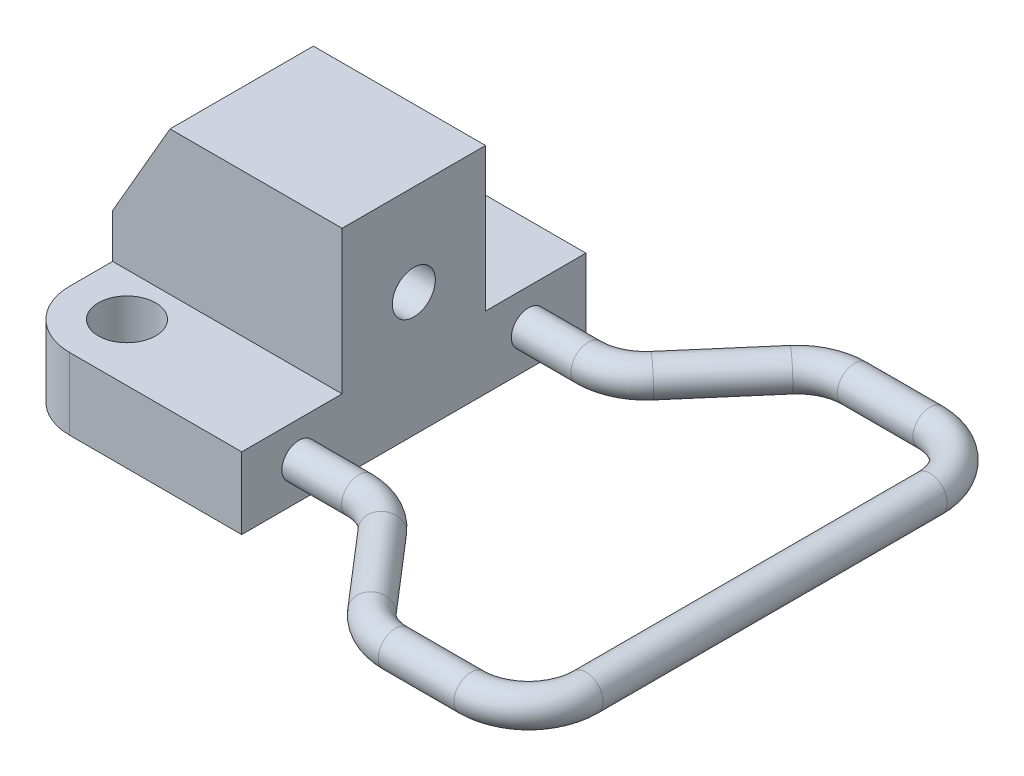
ISO-10303-21;
HEADER;
FILE_DESCRIPTION(('STEP AP214'),'2;1');
FILE_NAME('part.step','',(''),(''),'','','');
FILE_SCHEMA(('AUTOMOTIVE_DESIGN { 1 0 10303 214 1 1 1 1 }'));
ENDSEC;
DATA;
#1=APPLICATION_CONTEXT('core data for automotive mechanical design processes');
#2=APPLICATION_PROTOCOL_DEFINITION('international standard','automotive_design',2000,#1);
#3=PRODUCT_CONTEXT('',#1,'mechanical');
#4=PRODUCT('Part','Part','',(#3));
#5=PRODUCT_RELATED_PRODUCT_CATEGORY('part','',(#4));
#6=PRODUCT_DEFINITION_FORMATION('','',#4);
#7=PRODUCT_DEFINITION_CONTEXT('part definition',#1,'design');
#8=PRODUCT_DEFINITION('design','',#6,#7);
#9=PRODUCT_DEFINITION_SHAPE('','',#8);
#10=(LENGTH_UNIT() NAMED_UNIT(*) SI_UNIT(.MILLI.,.METRE.));
#11=(NAMED_UNIT(*) PLANE_ANGLE_UNIT() SI_UNIT($,.RADIAN.));
#12=(NAMED_UNIT(*) SI_UNIT($,.STERADIAN.) SOLID_ANGLE_UNIT());
#13=UNCERTAINTY_MEASURE_WITH_UNIT(LENGTH_MEASURE(1.E-05),#10,'distance_accuracy_value','');
#14=(GEOMETRIC_REPRESENTATION_CONTEXT(3) GLOBAL_UNCERTAINTY_ASSIGNED_CONTEXT((#13)) GLOBAL_UNIT_ASSIGNED_CONTEXT((#10,
#11,#12)) REPRESENTATION_CONTEXT('',''));
#15=CARTESIAN_POINT('',(0.,0.,0.));
#16=DIRECTION('',(0.,0.,1.));
#17=DIRECTION('',(1.,0.,0.));
#18=AXIS2_PLACEMENT_3D('',#15,#16,#17);
#19=CARTESIAN_POINT('',(40.,0.,0.));
#20=DIRECTION('',(-1.,0.,0.));
#21=DIRECTION('',(0.,0.,1.));
#22=AXIS2_PLACEMENT_3D('',#19,#20,#21);
#23=PLANE('',#22);
#24=CARTESIAN_POINT('',(40.,-12.5,-40.));
#25=DIRECTION('',(-1.,0.,0.));
#26=DIRECTION('',(0.,0.,1.));
#27=AXIS2_PLACEMENT_3D('',#24,#25,#26);
#28=CIRCLE('',#27,6.);
#29=CARTESIAN_POINT('',(40.,-12.5,-34.));
#30=VERTEX_POINT('',#29);
#31=EDGE_CURVE('E340',#30,#30,#28,.T.);
#32=ORIENTED_EDGE('',*,*,#31,.T.);
#33=EDGE_LOOP('',(#32));
#34=FACE_BOUND('',#33,.T.);
#35=CARTESIAN_POINT('',(40.,18.2151583266887,0.));
#36=DIRECTION('',(-1.,0.,0.));
#37=DIRECTION('',(0.,0.,1.));
#38=AXIS2_PLACEMENT_3D('',#35,#36,#37);
#39=CIRCLE('',#38,7.5);
#40=CARTESIAN_POINT('',(40.,18.2151583266887,7.5));
#41=VERTEX_POINT('',#40);
#42=EDGE_CURVE('E335',#41,#41,#39,.T.);
#43=ORIENTED_EDGE('',*,*,#42,.T.);
#44=EDGE_LOOP('',(#43));
#45=FACE_BOUND('',#44,.T.);
#46=DIRECTION('',(0.,-1.,0.));
#47=VECTOR('',#46,1.);
#48=CARTESIAN_POINT('',(40.,-25.,60.));
#49=LINE('',#48,#47);
#50=CARTESIAN_POINT('',(40.,0.,60.));
#51=VERTEX_POINT('',#50);
#52=CARTESIAN_POINT('',(40.,-25.,60.));
#53=VERTEX_POINT('',#52);
#54=EDGE_CURVE('E158',#51,#53,#49,.T.);
#55=ORIENTED_EDGE('',*,*,#54,.T.);
#56=DIRECTION('',(0.,0.,-1.));
#57=VECTOR('',#56,1.);
#58=CARTESIAN_POINT('',(40.,-25.,-60.));
#59=LINE('',#58,#57);
#60=CARTESIAN_POINT('',(40.,-25.,-60.));
#61=VERTEX_POINT('',#60);
#62=EDGE_CURVE('E147',#53,#61,#59,.T.);
#63=ORIENTED_EDGE('',*,*,#62,.T.);
#64=DIRECTION('',(0.,1.,0.));
#65=VECTOR('',#64,1.);
#66=CARTESIAN_POINT('',(40.,0.,-60.));
#67=LINE('',#66,#65);
#68=CARTESIAN_POINT('',(40.,0.,-60.));
#69=VERTEX_POINT('',#68);
#70=EDGE_CURVE('E157',#61,#69,#67,.T.);
#71=ORIENTED_EDGE('',*,*,#70,.T.);
#72=DIRECTION('',(0.,0.,1.));
#73=VECTOR('',#72,1.);
#74=CARTESIAN_POINT('',(40.,0.,-25.));
#75=LINE('',#74,#73);
#76=CARTESIAN_POINT('',(40.,0.,-25.));
#77=VERTEX_POINT('',#76);
#78=EDGE_CURVE('E300',#69,#77,#75,.T.);
#79=ORIENTED_EDGE('',*,*,#78,.T.);
#80=DIRECTION('',(0.,1.,0.));
#81=VECTOR('',#80,1.);
#82=CARTESIAN_POINT('',(40.,50.,-25.));
#83=LINE('',#82,#81);
#84=CARTESIAN_POINT('',(40.,50.,-25.));
#85=VERTEX_POINT('',#84);
#86=EDGE_CURVE('E318',#77,#85,#83,.T.);
#87=ORIENTED_EDGE('',*,*,#86,.T.);
#88=DIRECTION('',(0.,0.,1.));
#89=VECTOR('',#88,1.);
#90=CARTESIAN_POINT('',(40.,50.,25.));
#91=LINE('',#90,#89);
#92=CARTESIAN_POINT('',(40.,50.,25.));
#93=VERTEX_POINT('',#92);
#94=EDGE_CURVE('E212',#85,#93,#91,.T.);
#95=ORIENTED_EDGE('',*,*,#94,.T.);
#96=DIRECTION('',(0.,-1.,0.));
#97=VECTOR('',#96,1.);
#98=CARTESIAN_POINT('',(40.,0.,25.));
#99=LINE('',#98,#97);
#100=CARTESIAN_POINT('',(40.,0.,25.));
#101=VERTEX_POINT('',#100);
#102=EDGE_CURVE('E288',#93,#101,#99,.T.);
#103=ORIENTED_EDGE('',*,*,#102,.T.);
#104=DIRECTION('',(0.,0.,1.));
#105=VECTOR('',#104,1.);
#106=CARTESIAN_POINT('',(40.,0.,60.));
#107=LINE('',#106,#105);
#108=EDGE_CURVE('E163',#101,#51,#107,.T.);
#109=ORIENTED_EDGE('',*,*,#108,.T.);
#110=EDGE_LOOP('',(#55,#63,#71,#79,#87,#95,#103,#109));
#111=FACE_BOUND('',#110,.T.);
#112=CARTESIAN_POINT('',(40.,-12.5,40.));
#113=DIRECTION('',(1.,0.,0.));
#114=DIRECTION('',(0.,0.,-1.));
#115=AXIS2_PLACEMENT_3D('',#112,#113,#114);
#116=CIRCLE('',#115,6.);
#117=CARTESIAN_POINT('',(40.,-12.5,34.));
#118=VERTEX_POINT('',#117);
#119=EDGE_CURVE('E12',#118,#118,#116,.T.);
#120=ORIENTED_EDGE('',*,*,#119,.F.);
#121=EDGE_LOOP('',(#120));
#122=FACE_BOUND('',#121,.T.);
#123=ADVANCED_FACE('F61',(#34,#45,#111,#122),#23,.F.);
#124=CARTESIAN_POINT('',(40.,-25.,60.));
#125=DIRECTION('',(0.,0.,-1.));
#126=DIRECTION('',(0.,1.,0.));
#127=AXIS2_PLACEMENT_3D('',#124,#125,#126);
#128=PLANE('',#127);
#129=DIRECTION('',(-1.,0.,0.));
#130=VECTOR('',#129,1.);
#131=CARTESIAN_POINT('',(40.,0.,60.));
#132=LINE('',#131,#130);
#133=CARTESIAN_POINT('',(-20.,0.,60.));
#134=VERTEX_POINT('',#133);
#135=EDGE_CURVE('E282',#51,#134,#132,.T.);
#136=ORIENTED_EDGE('',*,*,#135,.T.);
#137=DIRECTION('',(0.,-1.,0.));
#138=VECTOR('',#137,1.);
#139=CARTESIAN_POINT('',(-20.,-25.,60.));
#140=LINE('',#139,#138);
#141=CARTESIAN_POINT('',(-20.,-25.,60.));
#142=VERTEX_POINT('',#141);
#143=EDGE_CURVE('E172',#134,#142,#140,.T.);
#144=ORIENTED_EDGE('',*,*,#143,.T.);
#145=DIRECTION('',(-1.,0.,0.));
#146=VECTOR('',#145,1.);
#147=CARTESIAN_POINT('',(40.,-25.,60.));
#148=LINE('',#147,#146);
#149=EDGE_CURVE('E152',#53,#142,#148,.T.);
#150=ORIENTED_EDGE('',*,*,#149,.F.);
#151=ORIENTED_EDGE('',*,*,#54,.F.);
#152=EDGE_LOOP('',(#136,#144,#150,#151));
#153=FACE_BOUND('',#152,.T.);
#154=ADVANCED_FACE('F170',(#153),#128,.F.);
#155=CARTESIAN_POINT('',(40.,-25.,-60.));
#156=DIRECTION('',(0.,1.,0.));
#157=DIRECTION('',(0.,0.,1.));
#158=AXIS2_PLACEMENT_3D('',#155,#156,#157);
#159=PLANE('',#158);
#160=CARTESIAN_POINT('',(-20.,-25.,40.));
#161=DIRECTION('',(0.,-1.,0.));
#162=DIRECTION('',(0.,0.,-1.));
#163=AXIS2_PLACEMENT_3D('',#160,#161,#162);
#164=CIRCLE('',#163,10.);
#165=CARTESIAN_POINT('',(-20.,-25.,30.));
#166=VERTEX_POINT('',#165);
#167=EDGE_CURVE('E325',#166,#166,#164,.T.);
#168=ORIENTED_EDGE('',*,*,#167,.F.);
#169=EDGE_LOOP('',(#168));
#170=FACE_BOUND('',#169,.T.);
#171=CARTESIAN_POINT('',(-20.,-25.,-40.));
#172=DIRECTION('',(0.,1.,0.));
#173=DIRECTION('',(0.,0.,1.));
#174=AXIS2_PLACEMENT_3D('',#171,#172,#173);
#175=CIRCLE('',#174,10.);
#176=CARTESIAN_POINT('',(-20.,-25.,-30.));
#177=VERTEX_POINT('',#176);
#178=EDGE_CURVE('E307',#177,#177,#175,.T.);
#179=ORIENTED_EDGE('',*,*,#178,.T.);
#180=EDGE_LOOP('',(#179));
#181=FACE_BOUND('',#180,.T.);
#182=DIRECTION('',(0.,0.,-1.));
#183=VECTOR('',#182,1.);
#184=CARTESIAN_POINT('',(-40.,-25.,-60.));
#185=LINE('',#184,#183);
#186=CARTESIAN_POINT('',(-40.,-25.,40.));
#187=VERTEX_POINT('',#186);
#188=CARTESIAN_POINT('',(-40.,-25.,-40.));
#189=VERTEX_POINT('',#188);
#190=EDGE_CURVE('E305',#187,#189,#185,.T.);
#191=ORIENTED_EDGE('',*,*,#190,.T.);
#192=CARTESIAN_POINT('',(-20.,-25.,-40.));
#193=DIRECTION('',(0.,1.,0.));
#194=DIRECTION('',(0.,0.,1.));
#195=AXIS2_PLACEMENT_3D('',#192,#193,#194);
#196=CIRCLE('',#195,20.);
#197=CARTESIAN_POINT('',(-20.,-25.,-60.));
#198=VERTEX_POINT('',#197);
#199=EDGE_CURVE('E189',#189,#198,#196,.F.);
#200=ORIENTED_EDGE('',*,*,#199,.T.);
#201=DIRECTION('',(-1.,0.,0.));
#202=VECTOR('',#201,1.);
#203=CARTESIAN_POINT('',(40.,-25.,-60.));
#204=LINE('',#203,#202);
#205=EDGE_CURVE('E154',#61,#198,#204,.T.);
#206=ORIENTED_EDGE('',*,*,#205,.F.);
#207=ORIENTED_EDGE('',*,*,#62,.F.);
#208=ORIENTED_EDGE('',*,*,#149,.T.);
#209=CARTESIAN_POINT('',(-20.,-25.,40.));
#210=DIRECTION('',(0.,1.,0.));
#211=DIRECTION('',(0.,0.,1.));
#212=AXIS2_PLACEMENT_3D('',#209,#210,#211);
#213=CIRCLE('',#212,20.);
#214=EDGE_CURVE('E187',#142,#187,#213,.F.);
#215=ORIENTED_EDGE('',*,*,#214,.T.);
#216=EDGE_LOOP('',(#191,#200,#206,#207,#208,#215));
#217=FACE_BOUND('',#216,.T.);
#218=ADVANCED_FACE('F150',(#170,#181,#217),#159,.F.);
#219=CARTESIAN_POINT('',(40.,0.,-60.));
#220=DIRECTION('',(0.,0.,1.));
#221=DIRECTION('',(0.,-1.,0.));
#222=AXIS2_PLACEMENT_3D('',#219,#220,#221);
#223=PLANE('',#222);
#224=ORIENTED_EDGE('',*,*,#205,.T.);
#225=DIRECTION('',(0.,1.,0.));
#226=VECTOR('',#225,1.);
#227=CARTESIAN_POINT('',(-20.,0.,-60.));
#228=LINE('',#227,#226);
#229=CARTESIAN_POINT('',(-20.,0.,-60.));
#230=VERTEX_POINT('',#229);
#231=EDGE_CURVE('E173',#198,#230,#228,.T.);
#232=ORIENTED_EDGE('',*,*,#231,.T.);
#233=DIRECTION('',(-1.,0.,0.));
#234=VECTOR('',#233,1.);
#235=CARTESIAN_POINT('',(40.,0.,-60.));
#236=LINE('',#235,#234);
#237=EDGE_CURVE('E178',#69,#230,#236,.T.);
#238=ORIENTED_EDGE('',*,*,#237,.F.);
#239=ORIENTED_EDGE('',*,*,#70,.F.);
#240=EDGE_LOOP('',(#224,#232,#238,#239));
#241=FACE_BOUND('',#240,.T.);
#242=ADVANCED_FACE('F261',(#241),#223,.F.);
#243=CARTESIAN_POINT('',(40.,0.,-25.));
#244=DIRECTION('',(0.,-1.,0.));
#245=DIRECTION('',(0.,0.,-1.));
#246=AXIS2_PLACEMENT_3D('',#243,#244,#245);
#247=PLANE('',#246);
#248=CARTESIAN_POINT('',(-20.,0.,-40.));
#249=DIRECTION('',(0.,1.,0.));
#250=DIRECTION('',(0.,0.,1.));
#251=AXIS2_PLACEMENT_3D('',#248,#249,#250);
#252=CIRCLE('',#251,10.);
#253=CARTESIAN_POINT('',(-20.,0.,-30.));
#254=VERTEX_POINT('',#253);
#255=EDGE_CURVE('E311',#254,#254,#252,.T.);
#256=ORIENTED_EDGE('',*,*,#255,.F.);
#257=EDGE_LOOP('',(#256));
#258=FACE_BOUND('',#257,.T.);
#259=ORIENTED_EDGE('',*,*,#237,.T.);
#260=CARTESIAN_POINT('',(-20.,0.,-40.));
#261=DIRECTION('',(0.,-1.,0.));
#262=DIRECTION('',(0.,0.,-1.));
#263=AXIS2_PLACEMENT_3D('',#260,#261,#262);
#264=CIRCLE('',#263,20.);
#265=CARTESIAN_POINT('',(-40.,0.,-40.));
#266=VERTEX_POINT('',#265);
#267=EDGE_CURVE('E176',#230,#266,#264,.F.);
#268=ORIENTED_EDGE('',*,*,#267,.T.);
#269=DIRECTION('',(0.,0.,1.));
#270=VECTOR('',#269,1.);
#271=CARTESIAN_POINT('',(-40.,0.,-25.));
#272=LINE('',#271,#270);
#273=CARTESIAN_POINT('',(-40.,0.,-25.));
#274=VERTEX_POINT('',#273);
#275=EDGE_CURVE('E306',#266,#274,#272,.T.);
#276=ORIENTED_EDGE('',*,*,#275,.T.);
#277=DIRECTION('',(-1.,0.,0.));
#278=VECTOR('',#277,1.);
#279=CARTESIAN_POINT('',(40.,0.,-25.));
#280=LINE('',#279,#278);
#281=EDGE_CURVE('E213',#77,#274,#280,.T.);
#282=ORIENTED_EDGE('',*,*,#281,.F.);
#283=ORIENTED_EDGE('',*,*,#78,.F.);
#284=EDGE_LOOP('',(#259,#268,#276,#282,#283));
#285=FACE_BOUND('',#284,.T.);
#286=ADVANCED_FACE('F258',(#258,#285),#247,.F.);
#287=CARTESIAN_POINT('',(40.,50.,-25.));
#288=DIRECTION('',(0.,0.,1.));
#289=DIRECTION('',(0.,-1.,0.));
#290=AXIS2_PLACEMENT_3D('',#287,#288,#289);
#291=PLANE('',#290);
#292=DIRECTION('',(0.,1.,0.));
#293=VECTOR('',#292,1.);
#294=CARTESIAN_POINT('',(-40.,50.,-25.));
#295=LINE('',#294,#293);
#296=CARTESIAN_POINT('',(-40.,15.3589838486225,-25.));
#297=VERTEX_POINT('',#296);
#298=EDGE_CURVE('E206',#274,#297,#295,.T.);
#299=ORIENTED_EDGE('',*,*,#298,.T.);
#300=DIRECTION('',(0.500000000000001,0.866025403784438,0.));
#301=VECTOR('',#300,1.);
#302=CARTESIAN_POINT('',(-20.,50.,-25.));
#303=LINE('',#302,#301);
#304=CARTESIAN_POINT('',(-20.,50.,-25.));
#305=VERTEX_POINT('',#304);
#306=EDGE_CURVE('E66',#297,#305,#303,.T.);
#307=ORIENTED_EDGE('',*,*,#306,.T.);
#308=DIRECTION('',(-1.,0.,0.));
#309=VECTOR('',#308,1.);
#310=CARTESIAN_POINT('',(40.,50.,-25.));
#311=LINE('',#310,#309);
#312=EDGE_CURVE('E203',#85,#305,#311,.T.);
#313=ORIENTED_EDGE('',*,*,#312,.F.);
#314=ORIENTED_EDGE('',*,*,#86,.F.);
#315=ORIENTED_EDGE('',*,*,#281,.T.);
#316=EDGE_LOOP('',(#299,#307,#313,#314,#315));
#317=FACE_BOUND('',#316,.T.);
#318=ADVANCED_FACE('F201',(#317),#291,.F.);
#319=CARTESIAN_POINT('',(40.,50.,25.));
#320=DIRECTION('',(0.,-1.,0.));
#321=DIRECTION('',(0.,0.,-1.));
#322=AXIS2_PLACEMENT_3D('',#319,#320,#321);
#323=PLANE('',#322);
#324=ORIENTED_EDGE('',*,*,#312,.T.);
#325=DIRECTION('',(0.,0.,1.));
#326=VECTOR('',#325,1.);
#327=CARTESIAN_POINT('',(-20.,50.,25.));
#328=LINE('',#327,#326);
#329=CARTESIAN_POINT('',(-20.,50.,25.));
#330=VERTEX_POINT('',#329);
#331=EDGE_CURVE('E194',#305,#330,#328,.T.);
#332=ORIENTED_EDGE('',*,*,#331,.T.);
#333=DIRECTION('',(-1.,0.,0.));
#334=VECTOR('',#333,1.);
#335=CARTESIAN_POINT('',(40.,50.,25.));
#336=LINE('',#335,#334);
#337=EDGE_CURVE('E214',#93,#330,#336,.T.);
#338=ORIENTED_EDGE('',*,*,#337,.F.);
#339=ORIENTED_EDGE('',*,*,#94,.F.);
#340=EDGE_LOOP('',(#324,#332,#338,#339));
#341=FACE_BOUND('',#340,.T.);
#342=ADVANCED_FACE('F210',(#341),#323,.F.);
#343=CARTESIAN_POINT('',(40.,0.,25.));
#344=DIRECTION('',(0.,0.,-1.));
#345=DIRECTION('',(0.,1.,0.));
#346=AXIS2_PLACEMENT_3D('',#343,#344,#345);
#347=PLANE('',#346);
#348=ORIENTED_EDGE('',*,*,#337,.T.);
#349=DIRECTION('',(-0.500000000000001,-0.866025403784438,0.));
#350=VECTOR('',#349,1.);
#351=CARTESIAN_POINT('',(-20.,50.,25.));
#352=LINE('',#351,#350);
#353=CARTESIAN_POINT('',(-40.,15.3589838486225,25.));
#354=VERTEX_POINT('',#353);
#355=EDGE_CURVE('E86',#330,#354,#352,.T.);
#356=ORIENTED_EDGE('',*,*,#355,.T.);
#357=DIRECTION('',(0.,-1.,0.));
#358=VECTOR('',#357,1.);
#359=CARTESIAN_POINT('',(-40.,0.,25.));
#360=LINE('',#359,#358);
#361=CARTESIAN_POINT('',(-40.,0.,25.));
#362=VERTEX_POINT('',#361);
#363=EDGE_CURVE('E315',#354,#362,#360,.T.);
#364=ORIENTED_EDGE('',*,*,#363,.T.);
#365=DIRECTION('',(-1.,0.,0.));
#366=VECTOR('',#365,1.);
#367=CARTESIAN_POINT('',(40.,0.,25.));
#368=LINE('',#367,#366);
#369=EDGE_CURVE('E285',#101,#362,#368,.T.);
#370=ORIENTED_EDGE('',*,*,#369,.F.);
#371=ORIENTED_EDGE('',*,*,#102,.F.);
#372=EDGE_LOOP('',(#348,#356,#364,#370,#371));
#373=FACE_BOUND('',#372,.T.);
#374=ADVANCED_FACE('F250',(#373),#347,.F.);
#375=CARTESIAN_POINT('',(40.,0.,60.));
#376=DIRECTION('',(0.,-1.,0.));
#377=DIRECTION('',(0.,0.,-1.));
#378=AXIS2_PLACEMENT_3D('',#375,#376,#377);
#379=PLANE('',#378);
#380=CARTESIAN_POINT('',(-20.,0.,40.));
#381=DIRECTION('',(0.,-1.,0.));
#382=DIRECTION('',(0.,0.,-1.));
#383=AXIS2_PLACEMENT_3D('',#380,#381,#382);
#384=CIRCLE('',#383,10.);
#385=CARTESIAN_POINT('',(-20.,0.,30.));
#386=VERTEX_POINT('',#385);
#387=EDGE_CURVE('E327',#386,#386,#384,.T.);
#388=ORIENTED_EDGE('',*,*,#387,.T.);
#389=EDGE_LOOP('',(#388));
#390=FACE_BOUND('',#389,.T.);
#391=DIRECTION('',(0.,0.,1.));
#392=VECTOR('',#391,1.);
#393=CARTESIAN_POINT('',(-40.,0.,60.));
#394=LINE('',#393,#392);
#395=CARTESIAN_POINT('',(-40.,0.,40.));
#396=VERTEX_POINT('',#395);
#397=EDGE_CURVE('E167',#362,#396,#394,.T.);
#398=ORIENTED_EDGE('',*,*,#397,.T.);
#399=CARTESIAN_POINT('',(-20.,0.,40.));
#400=DIRECTION('',(0.,-1.,0.));
#401=DIRECTION('',(0.,0.,-1.));
#402=AXIS2_PLACEMENT_3D('',#399,#400,#401);
#403=CIRCLE('',#402,20.);
#404=EDGE_CURVE('E192',#396,#134,#403,.F.);
#405=ORIENTED_EDGE('',*,*,#404,.T.);
#406=ORIENTED_EDGE('',*,*,#135,.F.);
#407=ORIENTED_EDGE('',*,*,#108,.F.);
#408=ORIENTED_EDGE('',*,*,#369,.T.);
#409=EDGE_LOOP('',(#398,#405,#406,#407,#408));
#410=FACE_BOUND('',#409,.T.);
#411=ADVANCED_FACE('F247',(#390,#410),#379,.F.);
#412=CARTESIAN_POINT('',(-40.,0.,0.));
#413=DIRECTION('',(-1.,0.,0.));
#414=DIRECTION('',(0.,0.,1.));
#415=AXIS2_PLACEMENT_3D('',#412,#413,#414);
#416=PLANE('',#415);
#417=ORIENTED_EDGE('',*,*,#363,.F.);
#418=DIRECTION('',(0.,0.,-1.));
#419=VECTOR('',#418,1.);
#420=CARTESIAN_POINT('',(-40.,15.3589838486225,-25.));
#421=LINE('',#420,#419);
#422=EDGE_CURVE('E78',#354,#297,#421,.T.);
#423=ORIENTED_EDGE('',*,*,#422,.T.);
#424=ORIENTED_EDGE('',*,*,#298,.F.);
#425=ORIENTED_EDGE('',*,*,#275,.F.);
#426=DIRECTION('',(0.,1.,0.));
#427=VECTOR('',#426,1.);
#428=CARTESIAN_POINT('',(-40.,-25.,-40.));
#429=LINE('',#428,#427);
#430=EDGE_CURVE('E185',#266,#189,#429,.F.);
#431=ORIENTED_EDGE('',*,*,#430,.T.);
#432=ORIENTED_EDGE('',*,*,#190,.F.);
#433=DIRECTION('',(0.,-1.,0.));
#434=VECTOR('',#433,1.);
#435=CARTESIAN_POINT('',(-40.,0.,40.));
#436=LINE('',#435,#434);
#437=EDGE_CURVE('E183',#187,#396,#436,.F.);
#438=ORIENTED_EDGE('',*,*,#437,.T.);
#439=ORIENTED_EDGE('',*,*,#397,.F.);
#440=EDGE_LOOP('',(#417,#423,#424,#425,#431,#432,#438,#439));
#441=FACE_BOUND('',#440,.T.);
#442=ADVANCED_FACE('F243',(#441),#416,.T.);
#443=CARTESIAN_POINT('',(-20.,0.,-40.));
#444=DIRECTION('',(0.,-1.,0.));
#445=DIRECTION('',(0.,0.,-1.));
#446=AXIS2_PLACEMENT_3D('',#443,#444,#445);
#447=CYLINDRICAL_SURFACE('',#446,20.);
#448=ORIENTED_EDGE('',*,*,#199,.F.);
#449=ORIENTED_EDGE('',*,*,#430,.F.);
#450=ORIENTED_EDGE('',*,*,#267,.F.);
#451=ORIENTED_EDGE('',*,*,#231,.F.);
#452=EDGE_LOOP('',(#448,#449,#450,#451));
#453=FACE_BOUND('',#452,.T.);
#454=ADVANCED_FACE('F246',(#453),#447,.T.);
#455=CARTESIAN_POINT('',(-20.,-25.,40.));
#456=DIRECTION('',(0.,1.,0.));
#457=DIRECTION('',(0.,0.,1.));
#458=AXIS2_PLACEMENT_3D('',#455,#456,#457);
#459=CYLINDRICAL_SURFACE('',#458,20.);
#460=ORIENTED_EDGE('',*,*,#404,.F.);
#461=ORIENTED_EDGE('',*,*,#437,.F.);
#462=ORIENTED_EDGE('',*,*,#214,.F.);
#463=ORIENTED_EDGE('',*,*,#143,.F.);
#464=EDGE_LOOP('',(#460,#461,#462,#463));
#465=FACE_BOUND('',#464,.T.);
#466=ADVANCED_FACE('F270',(#465),#459,.T.);
#467=CARTESIAN_POINT('',(-20.,-25.,-40.));
#468=DIRECTION('',(0.,1.,0.));
#469=DIRECTION('',(0.,0.,1.));
#470=AXIS2_PLACEMENT_3D('',#467,#468,#469);
#471=CYLINDRICAL_SURFACE('',#470,10.);
#472=ORIENTED_EDGE('',*,*,#178,.F.);
#473=EDGE_LOOP('',(#472));
#474=FACE_BOUND('',#473,.T.);
#475=ORIENTED_EDGE('',*,*,#255,.T.);
#476=EDGE_LOOP('',(#475));
#477=FACE_BOUND('',#476,.T.);
#478=ADVANCED_FACE('F228',(#474,#477),#471,.F.);
#479=CARTESIAN_POINT('',(-20.,-25.,40.));
#480=DIRECTION('',(0.,1.,0.));
#481=DIRECTION('',(0.,0.,1.));
#482=AXIS2_PLACEMENT_3D('',#479,#480,#481);
#483=CYLINDRICAL_SURFACE('',#482,10.);
#484=ORIENTED_EDGE('',*,*,#167,.T.);
#485=EDGE_LOOP('',(#484));
#486=FACE_BOUND('',#485,.T.);
#487=ORIENTED_EDGE('',*,*,#387,.F.);
#488=EDGE_LOOP('',(#487));
#489=FACE_BOUND('',#488,.T.);
#490=ADVANCED_FACE('F218',(#486,#489),#483,.F.);
#491=CARTESIAN_POINT('',(-20.,50.,25.));
#492=DIRECTION('',(-0.866025403784438,0.500000000000001,0.));
#493=DIRECTION('',(0.,0.,-1.));
#494=AXIS2_PLACEMENT_3D('',#491,#492,#493);
#495=PLANE('',#494);
#496=CARTESIAN_POINT('',(-30.,32.6794919243112,0.));
#497=DIRECTION('',(-0.866025403784438,0.500000000000001,0.));
#498=DIRECTION('',(-0.500000000000001,-0.866025403784438,0.));
#499=AXIS2_PLACEMENT_3D('',#496,#497,#498);
#500=CIRCLE('',#499,7.5);
#501=CARTESIAN_POINT('',(-33.75,26.1843013959279,0.));
#502=VERTEX_POINT('',#501);
#503=EDGE_CURVE('E330',#502,#502,#500,.T.);
#504=ORIENTED_EDGE('',*,*,#503,.F.);
#505=EDGE_LOOP('',(#504));
#506=FACE_BOUND('',#505,.T.);
#507=ORIENTED_EDGE('',*,*,#306,.F.);
#508=ORIENTED_EDGE('',*,*,#422,.F.);
#509=ORIENTED_EDGE('',*,*,#355,.F.);
#510=ORIENTED_EDGE('',*,*,#331,.F.);
#511=EDGE_LOOP('',(#507,#508,#509,#510));
#512=FACE_BOUND('',#511,.T.);
#513=ADVANCED_FACE('F64',(#506,#512),#495,.T.);
#514=CARTESIAN_POINT('',(-30.8660254037844,33.1794919243112,0.));
#515=DIRECTION('',(0.866025403784438,-0.500000000000001,0.));
#516=DIRECTION('',(0.500000000000001,0.866025403784438,0.));
#517=AXIS2_PLACEMENT_3D('',#514,#515,#516);
#518=CYLINDRICAL_SURFACE('',#517,7.5);
#519=CARTESIAN_POINT('',(-11.9085635383587,22.2343962131556,0.));
#520=DIRECTION('',(-0.866025403784438,0.500000000000001,0.));
#521=DIRECTION('',(0.,0.,1.));
#522=AXIS2_PLACEMENT_3D('',#519,#520,#521);
#523=CIRCLE('',#522,7.5);
#524=CARTESIAN_POINT('',(-15.6585635383587,15.7392056847723,0.));
#525=VERTEX_POINT('',#524);
#526=EDGE_CURVE('E336',#525,#525,#523,.T.);
#527=ORIENTED_EDGE('',*,*,#526,.F.);
#528=EDGE_LOOP('',(#527));
#529=FACE_BOUND('',#528,.T.);
#530=ORIENTED_EDGE('',*,*,#503,.T.);
#531=EDGE_LOOP('',(#530));
#532=FACE_BOUND('',#531,.T.);
#533=ADVANCED_FACE('F217',(#529,#532),#518,.F.);
#534=CARTESIAN_POINT('',(3.09143646164136,48.2151583266887,0.));
#535=DIRECTION('',(0.,0.,1.));
#536=DIRECTION('',(1.,0.,0.));
#537=AXIS2_PLACEMENT_3D('',#534,#535,#536);
#538=TOROIDAL_SURFACE('',#537,30.,7.5);
#539=CARTESIAN_POINT('',(3.09143646164135,18.2151583266887,0.));
#540=DIRECTION('',(-1.,0.,0.));
#541=DIRECTION('',(0.,0.,1.));
#542=AXIS2_PLACEMENT_3D('',#539,#540,#541);
#543=CIRCLE('',#542,7.5);
#544=CARTESIAN_POINT('',(3.09143646164135,10.7151583266887,0.));
#545=VERTEX_POINT('',#544);
#546=EDGE_CURVE('E339',#545,#545,#543,.T.);
#547=CARTESIAN_POINT('',(3.09143646164136,48.2151583266887,0.));
#548=DIRECTION('',(0.,0.,1.));
#549=DIRECTION('',(1.,0.,0.));
#550=AXIS2_PLACEMENT_3D('',#547,#548,#549);
#551=CIRCLE('',#550,37.5);
#552=EDGE_CURVE('',#525,#545,#551,.T.);
#553=ORIENTED_EDGE('',*,*,#526,.T.);
#554=ORIENTED_EDGE('',*,*,#546,.F.);
#555=ORIENTED_EDGE('',*,*,#552,.T.);
#556=ORIENTED_EDGE('',*,*,#552,.F.);
#557=EDGE_LOOP('',(#553,#555,#554,#556));
#558=FACE_BOUND('',#557,.T.);
#559=ADVANCED_FACE('F224',(#558),#538,.F.);
#560=CARTESIAN_POINT('',(3.09143646164135,18.2151583266887,0.));
#561=DIRECTION('',(1.,0.,0.));
#562=DIRECTION('',(0.,1.,0.));
#563=AXIS2_PLACEMENT_3D('',#560,#561,#562);
#564=CYLINDRICAL_SURFACE('',#563,7.5);
#565=ORIENTED_EDGE('',*,*,#42,.F.);
#566=EDGE_LOOP('',(#565));
#567=FACE_BOUND('',#566,.T.);
#568=ORIENTED_EDGE('',*,*,#546,.T.);
#569=EDGE_LOOP('',(#568));
#570=FACE_BOUND('',#569,.T.);
#571=ADVANCED_FACE('F227',(#567,#570),#564,.F.);
#572=CARTESIAN_POINT('',(40.,-12.5,40.));
#573=DIRECTION('',(1.,0.,0.));
#574=DIRECTION('',(0.,0.,-1.));
#575=AXIS2_PLACEMENT_3D('',#572,#573,#574);
#576=CYLINDRICAL_SURFACE('',#575,6.);
#577=CARTESIAN_POINT('',(60.8279153229092,-12.5,40.));
#578=DIRECTION('',(1.,0.,0.));
#579=DIRECTION('',(0.,0.,-1.));
#580=AXIS2_PLACEMENT_3D('',#577,#578,#579);
#581=CIRCLE('',#580,6.);
#582=CARTESIAN_POINT('',(60.8279153229092,-12.5,34.0000000000002));
#583=VERTEX_POINT('',#582);
#584=EDGE_CURVE('E379',#583,#583,#581,.T.);
#585=ORIENTED_EDGE('',*,*,#584,.F.);
#586=EDGE_LOOP('',(#585));
#587=FACE_BOUND('',#586,.T.);
#588=ORIENTED_EDGE('',*,*,#119,.T.);
#589=EDGE_LOOP('',(#588));
#590=FACE_BOUND('',#589,.T.);
#591=ADVANCED_FACE('F385',(#587,#590),#576,.T.);
#592=CARTESIAN_POINT('',(60.8279153229093,-12.5,60.));
#593=DIRECTION('',(0.,-1.,0.));
#594=DIRECTION('',(0.,0.,-1.));
#595=AXIS2_PLACEMENT_3D('',#592,#593,#594);
#596=TOROIDAL_SURFACE('',#595,19.9999999999998,6.);
#597=CARTESIAN_POINT('',(75.9844045505853,-12.5,46.9508301301829));
#598=DIRECTION('',(0.652458493490857,0.,0.757824461383796));
#599=DIRECTION('',(0.757824461383796,0.,-0.652458493490857));
#600=AXIS2_PLACEMENT_3D('',#597,#598,#599);
#601=CIRCLE('',#600,6.);
#602=CARTESIAN_POINT('',(80.5313513188879,-12.5,43.0360791692378));
#603=VERTEX_POINT('',#602);
#604=EDGE_CURVE('E376',#603,#603,#601,.T.);
#605=CARTESIAN_POINT('',(60.8279153229093,-12.5,60.));
#606=DIRECTION('',(0.,-1.,0.));
#607=DIRECTION('',(0.,0.,-1.));
#608=AXIS2_PLACEMENT_3D('',#605,#606,#607);
#609=CIRCLE('',#608,25.9999999999998);
#610=EDGE_CURVE('',#583,#603,#609,.T.);
#611=ORIENTED_EDGE('',*,*,#584,.T.);
#612=ORIENTED_EDGE('',*,*,#604,.F.);
#613=ORIENTED_EDGE('',*,*,#610,.T.);
#614=ORIENTED_EDGE('',*,*,#610,.F.);
#615=EDGE_LOOP('',(#611,#613,#612,#614));
#616=FACE_BOUND('',#615,.T.);
#617=ADVANCED_FACE('F383',(#616),#596,.T.);
#618=CARTESIAN_POINT('',(75.9844045505853,-12.5,46.9508301301829));
#619=DIRECTION('',(0.65245849349086,0.,0.757824461383794));
#620=DIRECTION('',(0.757824461383794,0.,-0.65245849349086));
#621=AXIS2_PLACEMENT_3D('',#618,#619,#620);
#622=CYLINDRICAL_SURFACE('',#621,6.);
#623=CARTESIAN_POINT('',(98.4540981232116,-12.5,73.0491698698172));
#624=DIRECTION('',(0.65245849349086,0.,0.757824461383794));
#625=DIRECTION('',(0.757824461383794,0.,-0.65245849349086));
#626=AXIS2_PLACEMENT_3D('',#623,#624,#625);
#627=CIRCLE('',#626,6.);
#628=CARTESIAN_POINT('',(93.9071513549088,-12.5,76.9639208307623));
#629=VERTEX_POINT('',#628);
#630=EDGE_CURVE('E373',#629,#629,#627,.T.);
#631=ORIENTED_EDGE('',*,*,#630,.F.);
#632=EDGE_LOOP('',(#631));
#633=FACE_BOUND('',#632,.T.);
#634=ORIENTED_EDGE('',*,*,#604,.T.);
#635=EDGE_LOOP('',(#634));
#636=FACE_BOUND('',#635,.T.);
#637=ADVANCED_FACE('F394',(#633,#636),#622,.T.);
#638=CARTESIAN_POINT('',(113.610587350887,-12.5,60.));
#639=DIRECTION('',(0.,1.,0.));
#640=DIRECTION('',(0.,0.,1.));
#641=AXIS2_PLACEMENT_3D('',#638,#639,#640);
#642=TOROIDAL_SURFACE('',#641,20.,6.);
#643=CARTESIAN_POINT('',(113.610587350887,-12.5,80.0000000000002));
#644=DIRECTION('',(1.,0.,0.));
#645=DIRECTION('',(0.,0.,-1.));
#646=AXIS2_PLACEMENT_3D('',#643,#644,#645);
#647=CIRCLE('',#646,6.);
#648=CARTESIAN_POINT('',(113.610587350887,-12.5,86.));
#649=VERTEX_POINT('',#648);
#650=EDGE_CURVE('E370',#649,#649,#647,.T.);
#651=CARTESIAN_POINT('',(113.610587350887,-12.5,60.));
#652=DIRECTION('',(0.,1.,0.));
#653=DIRECTION('',(0.,0.,1.));
#654=AXIS2_PLACEMENT_3D('',#651,#652,#653);
#655=CIRCLE('',#654,26.);
#656=EDGE_CURVE('',#629,#649,#655,.T.);
#657=ORIENTED_EDGE('',*,*,#630,.T.);
#658=ORIENTED_EDGE('',*,*,#650,.F.);
#659=ORIENTED_EDGE('',*,*,#656,.T.);
#660=ORIENTED_EDGE('',*,*,#656,.F.);
#661=EDGE_LOOP('',(#657,#659,#658,#660));
#662=FACE_BOUND('',#661,.T.);
#663=ADVANCED_FACE('F402',(#662),#642,.T.);
#664=CARTESIAN_POINT('',(113.610587350888,-12.5,80.));
#665=DIRECTION('',(1.,0.,0.));
#666=DIRECTION('',(0.,0.,-1.));
#667=AXIS2_PLACEMENT_3D('',#664,#665,#666);
#668=CYLINDRICAL_SURFACE('',#667,6.);
#669=CARTESIAN_POINT('',(140.,-12.5,80.));
#670=DIRECTION('',(1.,0.,0.));
#671=DIRECTION('',(0.,0.,-1.));
#672=AXIS2_PLACEMENT_3D('',#669,#670,#671);
#673=CIRCLE('',#672,6.);
#674=CARTESIAN_POINT('',(140.,-12.5,85.9999999999997));
#675=VERTEX_POINT('',#674);
#676=EDGE_CURVE('E367',#675,#675,#673,.T.);
#677=ORIENTED_EDGE('',*,*,#676,.F.);
#678=EDGE_LOOP('',(#677));
#679=FACE_BOUND('',#678,.T.);
#680=ORIENTED_EDGE('',*,*,#650,.T.);
#681=EDGE_LOOP('',(#680));
#682=FACE_BOUND('',#681,.T.);
#683=ADVANCED_FACE('F406',(#679,#682),#668,.T.);
#684=CARTESIAN_POINT('',(140.,-12.5,60.));
#685=DIRECTION('',(0.,1.,0.));
#686=DIRECTION('',(0.,0.,1.));
#687=AXIS2_PLACEMENT_3D('',#684,#685,#686);
#688=TOROIDAL_SURFACE('',#687,19.9999999999996,6.);
#689=CARTESIAN_POINT('',(160.,-12.5,59.9999999999999));
#690=DIRECTION('',(0.,0.,-1.));
#691=DIRECTION('',(-1.,0.,0.));
#692=AXIS2_PLACEMENT_3D('',#689,#690,#691);
#693=CIRCLE('',#692,6.);
#694=CARTESIAN_POINT('',(166.,-12.5,59.9999999999998));
#695=VERTEX_POINT('',#694);
#696=EDGE_CURVE('E364',#695,#695,#693,.T.);
#697=CARTESIAN_POINT('',(140.,-12.5,60.));
#698=DIRECTION('',(0.,1.,0.));
#699=DIRECTION('',(0.,0.,1.));
#700=AXIS2_PLACEMENT_3D('',#697,#698,#699);
#701=CIRCLE('',#700,25.9999999999996);
#702=EDGE_CURVE('',#675,#695,#701,.T.);
#703=ORIENTED_EDGE('',*,*,#676,.T.);
#704=ORIENTED_EDGE('',*,*,#696,.F.);
#705=ORIENTED_EDGE('',*,*,#702,.T.);
#706=ORIENTED_EDGE('',*,*,#702,.F.);
#707=EDGE_LOOP('',(#703,#705,#704,#706));
#708=FACE_BOUND('',#707,.T.);
#709=ADVANCED_FACE('F410',(#708),#688,.T.);
#710=CARTESIAN_POINT('',(160.,-12.5,59.9999999999999));
#711=DIRECTION('',(0.,0.,-1.));
#712=DIRECTION('',(0.,1.,0.));
#713=AXIS2_PLACEMENT_3D('',#710,#711,#712);
#714=CYLINDRICAL_SURFACE('',#713,6.);
#715=CARTESIAN_POINT('',(160.,-12.5,-59.9999999999999));
#716=DIRECTION('',(0.,0.,-1.));
#717=DIRECTION('',(-1.,0.,0.));
#718=AXIS2_PLACEMENT_3D('',#715,#716,#717);
#719=CIRCLE('',#718,6.);
#720=CARTESIAN_POINT('',(166.,-12.5,-59.9999999999998));
#721=VERTEX_POINT('',#720);
#722=EDGE_CURVE('E361',#721,#721,#719,.T.);
#723=ORIENTED_EDGE('',*,*,#722,.F.);
#724=EDGE_LOOP('',(#723));
#725=FACE_BOUND('',#724,.T.);
#726=ORIENTED_EDGE('',*,*,#696,.T.);
#727=EDGE_LOOP('',(#726));
#728=FACE_BOUND('',#727,.T.);
#729=ADVANCED_FACE('F414',(#725,#728),#714,.T.);
#730=CARTESIAN_POINT('',(140.,-12.5,-60.));
#731=DIRECTION('',(0.,1.,0.));
#732=DIRECTION('',(0.,0.,1.));
#733=AXIS2_PLACEMENT_3D('',#730,#731,#732);
#734=TOROIDAL_SURFACE('',#733,20.,6.);
#735=CARTESIAN_POINT('',(140.,-12.5,-80.));
#736=DIRECTION('',(-1.,0.,0.));
#737=DIRECTION('',(0.,0.,1.));
#738=AXIS2_PLACEMENT_3D('',#735,#736,#737);
#739=CIRCLE('',#738,6.);
#740=CARTESIAN_POINT('',(140.,-12.5,-86.));
#741=VERTEX_POINT('',#740);
#742=EDGE_CURVE('E358',#741,#741,#739,.T.);
#743=CARTESIAN_POINT('',(140.,-12.5,-60.));
#744=DIRECTION('',(0.,1.,0.));
#745=DIRECTION('',(0.,0.,1.));
#746=AXIS2_PLACEMENT_3D('',#743,#744,#745);
#747=CIRCLE('',#746,26.);
#748=EDGE_CURVE('',#721,#741,#747,.T.);
#749=ORIENTED_EDGE('',*,*,#722,.T.);
#750=ORIENTED_EDGE('',*,*,#742,.F.);
#751=ORIENTED_EDGE('',*,*,#748,.T.);
#752=ORIENTED_EDGE('',*,*,#748,.F.);
#753=EDGE_LOOP('',(#749,#751,#750,#752));
#754=FACE_BOUND('',#753,.T.);
#755=ADVANCED_FACE('F418',(#754),#734,.T.);
#756=CARTESIAN_POINT('',(140.,-12.5,-80.));
#757=DIRECTION('',(-1.,0.,0.));
#758=DIRECTION('',(0.,0.,1.));
#759=AXIS2_PLACEMENT_3D('',#756,#757,#758);
#760=CYLINDRICAL_SURFACE('',#759,6.);
#761=CARTESIAN_POINT('',(113.610587350887,-12.5,-80.));
#762=DIRECTION('',(-1.,0.,0.));
#763=DIRECTION('',(0.,0.,1.));
#764=AXIS2_PLACEMENT_3D('',#761,#762,#763);
#765=CIRCLE('',#764,6.);
#766=CARTESIAN_POINT('',(113.610587350887,-12.5,-86.));
#767=VERTEX_POINT('',#766);
#768=EDGE_CURVE('E355',#767,#767,#765,.T.);
#769=ORIENTED_EDGE('',*,*,#768,.F.);
#770=EDGE_LOOP('',(#769));
#771=FACE_BOUND('',#770,.T.);
#772=ORIENTED_EDGE('',*,*,#742,.T.);
#773=EDGE_LOOP('',(#772));
#774=FACE_BOUND('',#773,.T.);
#775=ADVANCED_FACE('F422',(#771,#774),#760,.T.);
#776=CARTESIAN_POINT('',(113.610587350887,-12.5,-60.));
#777=DIRECTION('',(0.,1.,0.));
#778=DIRECTION('',(0.,0.,1.));
#779=AXIS2_PLACEMENT_3D('',#776,#777,#778);
#780=TOROIDAL_SURFACE('',#779,20.,6.);
#781=CARTESIAN_POINT('',(98.4540981232115,-12.5,-73.0491698698171));
#782=DIRECTION('',(-0.652458493490856,0.,0.757824461383797));
#783=DIRECTION('',(0.757824461383797,0.,0.652458493490856));
#784=AXIS2_PLACEMENT_3D('',#781,#782,#783);
#785=CIRCLE('',#784,6.);
#786=CARTESIAN_POINT('',(93.9071513549088,-12.5,-76.9639208307623));
#787=VERTEX_POINT('',#786);
#788=EDGE_CURVE('E352',#787,#787,#785,.T.);
#789=CARTESIAN_POINT('',(113.610587350887,-12.5,-60.));
#790=DIRECTION('',(0.,1.,0.));
#791=DIRECTION('',(0.,0.,1.));
#792=AXIS2_PLACEMENT_3D('',#789,#790,#791);
#793=CIRCLE('',#792,26.);
#794=EDGE_CURVE('',#767,#787,#793,.T.);
#795=ORIENTED_EDGE('',*,*,#768,.T.);
#796=ORIENTED_EDGE('',*,*,#788,.F.);
#797=ORIENTED_EDGE('',*,*,#794,.T.);
#798=ORIENTED_EDGE('',*,*,#794,.F.);
#799=EDGE_LOOP('',(#795,#797,#796,#798));
#800=FACE_BOUND('',#799,.T.);
#801=ADVANCED_FACE('F426',(#800),#780,.T.);
#802=CARTESIAN_POINT('',(98.4540981232116,-12.5,-73.0491698698171));
#803=DIRECTION('',(-0.65245849349086,0.,0.757824461383794));
#804=DIRECTION('',(0.757824461383794,0.,0.65245849349086));
#805=AXIS2_PLACEMENT_3D('',#802,#803,#804);
#806=CYLINDRICAL_SURFACE('',#805,6.);
#807=CARTESIAN_POINT('',(75.9844045505853,-12.5,-46.9508301301829));
#808=DIRECTION('',(-0.652458493490859,0.,0.757824461383795));
#809=DIRECTION('',(0.757824461383795,0.,0.652458493490859));
#810=AXIS2_PLACEMENT_3D('',#807,#808,#809);
#811=CIRCLE('',#810,6.);
#812=CARTESIAN_POINT('',(80.531351318888,-12.5,-43.0360791692377));
#813=VERTEX_POINT('',#812);
#814=EDGE_CURVE('E349',#813,#813,#811,.T.);
#815=ORIENTED_EDGE('',*,*,#814,.F.);
#816=EDGE_LOOP('',(#815));
#817=FACE_BOUND('',#816,.T.);
#818=ORIENTED_EDGE('',*,*,#788,.T.);
#819=EDGE_LOOP('',(#818));
#820=FACE_BOUND('',#819,.T.);
#821=ADVANCED_FACE('F430',(#817,#820),#806,.T.);
#822=CARTESIAN_POINT('',(60.8279153229093,-12.5,-60.));
#823=DIRECTION('',(0.,-1.,0.));
#824=DIRECTION('',(0.,0.,-1.));
#825=AXIS2_PLACEMENT_3D('',#822,#823,#824);
#826=TOROIDAL_SURFACE('',#825,20.,6.);
#827=CARTESIAN_POINT('',(60.8279153229093,-12.5,-40.));
#828=DIRECTION('',(-1.,0.,0.));
#829=DIRECTION('',(0.,0.,1.));
#830=AXIS2_PLACEMENT_3D('',#827,#828,#829);
#831=CIRCLE('',#830,6.);
#832=CARTESIAN_POINT('',(60.8279153229093,-12.5,-34.));
#833=VERTEX_POINT('',#832);
#834=EDGE_CURVE('E346',#833,#833,#831,.T.);
#835=CARTESIAN_POINT('',(60.8279153229093,-12.5,-60.));
#836=DIRECTION('',(0.,-1.,0.));
#837=DIRECTION('',(0.,0.,-1.));
#838=AXIS2_PLACEMENT_3D('',#835,#836,#837);
#839=CIRCLE('',#838,26.);
#840=EDGE_CURVE('',#813,#833,#839,.T.);
#841=ORIENTED_EDGE('',*,*,#814,.T.);
#842=ORIENTED_EDGE('',*,*,#834,.F.);
#843=ORIENTED_EDGE('',*,*,#840,.T.);
#844=ORIENTED_EDGE('',*,*,#840,.F.);
#845=EDGE_LOOP('',(#841,#843,#842,#844));
#846=FACE_BOUND('',#845,.T.);
#847=ADVANCED_FACE('F434',(#846),#826,.T.);
#848=CARTESIAN_POINT('',(60.8279153229092,-12.5,-40.));
#849=DIRECTION('',(-1.,0.,0.));
#850=DIRECTION('',(0.,0.,1.));
#851=AXIS2_PLACEMENT_3D('',#848,#849,#850);
#852=CYLINDRICAL_SURFACE('',#851,6.);
#853=ORIENTED_EDGE('',*,*,#31,.F.);
#854=EDGE_LOOP('',(#853));
#855=FACE_BOUND('',#854,.T.);
#856=ORIENTED_EDGE('',*,*,#834,.T.);
#857=EDGE_LOOP('',(#856));
#858=FACE_BOUND('',#857,.T.);
#859=ADVANCED_FACE('F438',(#855,#858),#852,.T.);
#860=CLOSED_SHELL('',(#123,#154,#218,#242,#286,#318,#342,#374,#411,#442,#454,#466,#478,#490,
#513,#533,#559,#571,#591,#617,#637,#663,#683,#709,#729,#755,#775,#801,#821,#847,#859));
#861=MANIFOLD_SOLID_BREP('B2',#860);
#862=ADVANCED_BREP_SHAPE_REPRESENTATION('',(#18,#861),#14);
#863=SHAPE_DEFINITION_REPRESENTATION(#9,#862);
ENDSEC;
END-ISO-10303-21;
